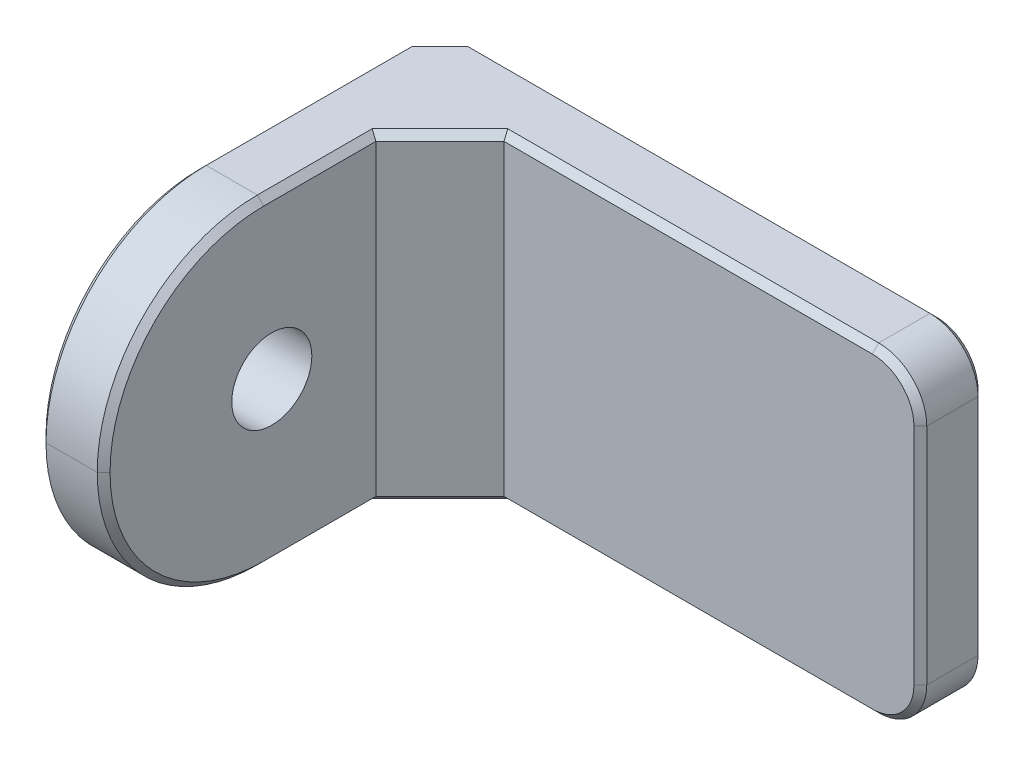
ISO-10303-21;
HEADER;
FILE_DESCRIPTION(('STEP AP214'),'2;1');
FILE_NAME('part.step','',(''),(''),'','','');
FILE_SCHEMA(('AUTOMOTIVE_DESIGN { 1 0 10303 214 1 1 1 1 }'));
ENDSEC;
DATA;
#1=APPLICATION_CONTEXT('core data for automotive mechanical design processes');
#2=APPLICATION_PROTOCOL_DEFINITION('international standard','automotive_design',2000,#1);
#3=PRODUCT_CONTEXT('',#1,'mechanical');
#4=PRODUCT('Part','Part','',(#3));
#5=PRODUCT_RELATED_PRODUCT_CATEGORY('part','',(#4));
#6=PRODUCT_DEFINITION_FORMATION('','',#4);
#7=PRODUCT_DEFINITION_CONTEXT('part definition',#1,'design');
#8=PRODUCT_DEFINITION('design','',#6,#7);
#9=PRODUCT_DEFINITION_SHAPE('','',#8);
#10=(LENGTH_UNIT() NAMED_UNIT(*) SI_UNIT(.MILLI.,.METRE.));
#11=(NAMED_UNIT(*) PLANE_ANGLE_UNIT() SI_UNIT($,.RADIAN.));
#12=(NAMED_UNIT(*) SI_UNIT($,.STERADIAN.) SOLID_ANGLE_UNIT());
#13=UNCERTAINTY_MEASURE_WITH_UNIT(LENGTH_MEASURE(1.E-05),#10,'distance_accuracy_value','');
#14=(GEOMETRIC_REPRESENTATION_CONTEXT(3) GLOBAL_UNCERTAINTY_ASSIGNED_CONTEXT((#13)) GLOBAL_UNIT_ASSIGNED_CONTEXT((#10,
#11,#12)) REPRESENTATION_CONTEXT('',''));
#15=CARTESIAN_POINT('',(0.,0.,0.));
#16=DIRECTION('',(0.,0.,1.));
#17=DIRECTION('',(1.,0.,0.));
#18=AXIS2_PLACEMENT_3D('',#15,#16,#17);
#19=CARTESIAN_POINT('',(0.,20.,0.));
#20=DIRECTION('',(1.,0.,0.));
#21=DIRECTION('',(0.,0.,-1.));
#22=AXIS2_PLACEMENT_3D('',#19,#20,#21);
#23=PLANE('',#22);
#24=DIRECTION('',(0.,-1.,0.));
#25=VECTOR('',#24,1.);
#26=CARTESIAN_POINT('',(0.,20.,-23.));
#27=LINE('',#26,#25);
#28=CARTESIAN_POINT('',(0.,19.6,-23.));
#29=VERTEX_POINT('',#28);
#30=CARTESIAN_POINT('',(0.,0.400000000000001,-23.));
#31=VERTEX_POINT('',#30);
#32=EDGE_CURVE('E377',#29,#31,#27,.T.);
#33=ORIENTED_EDGE('',*,*,#32,.T.);
#34=DIRECTION('',(0.,0.,1.));
#35=VECTOR('',#34,1.);
#36=CARTESIAN_POINT('',(0.,0.400000000000001,-10.));
#37=LINE('',#36,#35);
#38=CARTESIAN_POINT('',(0.,0.400000000000001,-10.));
#39=VERTEX_POINT('',#38);
#40=EDGE_CURVE('E317',#31,#39,#37,.T.);
#41=ORIENTED_EDGE('',*,*,#40,.T.);
#42=CARTESIAN_POINT('',(0.,10.,-10.));
#43=DIRECTION('',(1.,0.,0.));
#44=DIRECTION('',(0.,0.,-1.));
#45=AXIS2_PLACEMENT_3D('',#42,#43,#44);
#46=CIRCLE('',#45,9.6);
#47=CARTESIAN_POINT('',(0.,10.,-0.400000000000001));
#48=VERTEX_POINT('',#47);
#49=EDGE_CURVE('E319',#39,#48,#46,.F.);
#50=ORIENTED_EDGE('',*,*,#49,.T.);
#51=CARTESIAN_POINT('',(0.,10.,-10.));
#52=DIRECTION('',(1.,0.,0.));
#53=DIRECTION('',(0.,0.,-1.));
#54=AXIS2_PLACEMENT_3D('',#51,#52,#53);
#55=CIRCLE('',#54,9.6);
#56=CARTESIAN_POINT('',(0.,19.6,-10.));
#57=VERTEX_POINT('',#56);
#58=EDGE_CURVE('E323',#48,#57,#55,.F.);
#59=ORIENTED_EDGE('',*,*,#58,.T.);
#60=DIRECTION('',(0.,0.,-1.));
#61=VECTOR('',#60,1.);
#62=CARTESIAN_POINT('',(0.,19.6,0.));
#63=LINE('',#62,#61);
#64=EDGE_CURVE('E321',#57,#29,#63,.T.);
#65=ORIENTED_EDGE('',*,*,#64,.T.);
#66=EDGE_LOOP('',(#33,#41,#50,#59,#65));
#67=FACE_BOUND('',#66,.T.);
#68=CARTESIAN_POINT('',(0.,10.,-10.5));
#69=DIRECTION('',(1.,0.,0.));
#70=DIRECTION('',(0.,0.,-1.));
#71=AXIS2_PLACEMENT_3D('',#68,#69,#70);
#72=CIRCLE('',#71,2.5);
#73=CARTESIAN_POINT('',(0.,10.,-13.));
#74=VERTEX_POINT('',#73);
#75=EDGE_CURVE('E395',#74,#74,#72,.T.);
#76=ORIENTED_EDGE('',*,*,#75,.T.);
#77=EDGE_LOOP('',(#76));
#78=FACE_BOUND('',#77,.T.);
#79=ADVANCED_FACE('F37',(#67,#78),#23,.F.);
#80=CARTESIAN_POINT('',(4.,20.,0.));
#81=DIRECTION('',(-1.,0.,0.));
#82=DIRECTION('',(0.,0.,1.));
#83=AXIS2_PLACEMENT_3D('',#80,#81,#82);
#84=PLANE('',#83);
#85=CARTESIAN_POINT('',(4.,10.,-10.5));
#86=DIRECTION('',(1.,0.,0.));
#87=DIRECTION('',(0.,0.,-1.));
#88=AXIS2_PLACEMENT_3D('',#85,#86,#87);
#89=CIRCLE('',#88,2.5);
#90=CARTESIAN_POINT('',(4.,10.,-13.));
#91=VERTEX_POINT('',#90);
#92=EDGE_CURVE('E389',#91,#91,#89,.T.);
#93=ORIENTED_EDGE('',*,*,#92,.F.);
#94=EDGE_LOOP('',(#93));
#95=FACE_BOUND('',#94,.T.);
#96=CARTESIAN_POINT('',(4.,10.,-10.));
#97=DIRECTION('',(-1.,0.,0.));
#98=DIRECTION('',(0.,0.,1.));
#99=AXIS2_PLACEMENT_3D('',#96,#97,#98);
#100=CIRCLE('',#99,9.6);
#101=CARTESIAN_POINT('',(4.,10.,-0.399999999999998));
#102=VERTEX_POINT('',#101);
#103=CARTESIAN_POINT('',(4.,0.399999999999998,-10.));
#104=VERTEX_POINT('',#103);
#105=EDGE_CURVE('E47',#102,#104,#100,.F.);
#106=ORIENTED_EDGE('',*,*,#105,.T.);
#107=DIRECTION('',(0.,0.,-1.));
#108=VECTOR('',#107,1.);
#109=CARTESIAN_POINT('',(4.,0.399999999999998,-17.));
#110=LINE('',#109,#108);
#111=CARTESIAN_POINT('',(4.,0.399999999999998,-17.));
#112=VERTEX_POINT('',#111);
#113=EDGE_CURVE('E11',#104,#112,#110,.T.);
#114=ORIENTED_EDGE('',*,*,#113,.T.);
#115=DIRECTION('',(0.,1.,0.));
#116=VECTOR('',#115,1.);
#117=CARTESIAN_POINT('',(4.,20.,-17.));
#118=LINE('',#117,#116);
#119=CARTESIAN_POINT('',(4.,19.6,-17.));
#120=VERTEX_POINT('',#119);
#121=EDGE_CURVE('E380',#112,#120,#118,.T.);
#122=ORIENTED_EDGE('',*,*,#121,.T.);
#123=DIRECTION('',(0.,0.,1.));
#124=VECTOR('',#123,1.);
#125=CARTESIAN_POINT('',(4.,19.6,0.));
#126=LINE('',#125,#124);
#127=CARTESIAN_POINT('',(4.,19.6,-10.));
#128=VERTEX_POINT('',#127);
#129=EDGE_CURVE('E292',#120,#128,#126,.T.);
#130=ORIENTED_EDGE('',*,*,#129,.T.);
#131=CARTESIAN_POINT('',(4.,10.,-10.));
#132=DIRECTION('',(-1.,0.,0.));
#133=DIRECTION('',(0.,0.,1.));
#134=AXIS2_PLACEMENT_3D('',#131,#132,#133);
#135=CIRCLE('',#134,9.6);
#136=EDGE_CURVE('E58',#128,#102,#135,.F.);
#137=ORIENTED_EDGE('',*,*,#136,.T.);
#138=EDGE_LOOP('',(#106,#114,#122,#130,#137));
#139=FACE_BOUND('',#138,.T.);
#140=ADVANCED_FACE('F404',(#95,#139),#84,.F.);
#141=CARTESIAN_POINT('',(4.,20.,-21.));
#142=DIRECTION('',(0.,0.,-1.));
#143=DIRECTION('',(-1.,0.,0.));
#144=AXIS2_PLACEMENT_3D('',#141,#142,#143);
#145=PLANE('',#144);
#146=DIRECTION('',(0.,-1.,0.));
#147=VECTOR('',#146,1.);
#148=CARTESIAN_POINT('',(8.00000000000002,0.,-21.));
#149=LINE('',#148,#147);
#150=CARTESIAN_POINT('',(8.00000000000002,19.6,-21.));
#151=VERTEX_POINT('',#150);
#152=CARTESIAN_POINT('',(8.00000000000002,0.399999999999998,-21.));
#153=VERTEX_POINT('',#152);
#154=EDGE_CURVE('E383',#151,#153,#149,.T.);
#155=ORIENTED_EDGE('',*,*,#154,.T.);
#156=DIRECTION('',(1.,0.,0.));
#157=VECTOR('',#156,1.);
#158=CARTESIAN_POINT('',(31.,0.399999999999998,-21.));
#159=LINE('',#158,#157);
#160=CARTESIAN_POINT('',(31.,0.399999999999998,-21.));
#161=VERTEX_POINT('',#160);
#162=EDGE_CURVE('E294',#153,#161,#159,.T.);
#163=ORIENTED_EDGE('',*,*,#162,.T.);
#164=CARTESIAN_POINT('',(31.,3.,-21.));
#165=DIRECTION('',(0.,0.,-1.));
#166=DIRECTION('',(-1.,0.,0.));
#167=AXIS2_PLACEMENT_3D('',#164,#165,#166);
#168=CIRCLE('',#167,2.6);
#169=CARTESIAN_POINT('',(33.6,3.,-21.));
#170=VERTEX_POINT('',#169);
#171=EDGE_CURVE('E296',#161,#170,#168,.F.);
#172=ORIENTED_EDGE('',*,*,#171,.T.);
#173=DIRECTION('',(0.,1.,0.));
#174=VECTOR('',#173,1.);
#175=CARTESIAN_POINT('',(33.6,20.,-21.));
#176=LINE('',#175,#174);
#177=CARTESIAN_POINT('',(33.6,17.,-21.));
#178=VERTEX_POINT('',#177);
#179=EDGE_CURVE('E298',#170,#178,#176,.T.);
#180=ORIENTED_EDGE('',*,*,#179,.T.);
#181=CARTESIAN_POINT('',(31.,17.,-21.));
#182=DIRECTION('',(0.,0.,-1.));
#183=DIRECTION('',(-1.,0.,0.));
#184=AXIS2_PLACEMENT_3D('',#181,#182,#183);
#185=CIRCLE('',#184,2.6);
#186=CARTESIAN_POINT('',(31.,19.6,-21.));
#187=VERTEX_POINT('',#186);
#188=EDGE_CURVE('E300',#178,#187,#185,.F.);
#189=ORIENTED_EDGE('',*,*,#188,.T.);
#190=DIRECTION('',(-1.,0.,0.));
#191=VECTOR('',#190,1.);
#192=CARTESIAN_POINT('',(4.,19.6,-21.));
#193=LINE('',#192,#191);
#194=EDGE_CURVE('E302',#187,#151,#193,.T.);
#195=ORIENTED_EDGE('',*,*,#194,.T.);
#196=EDGE_LOOP('',(#155,#163,#172,#180,#189,#195));
#197=FACE_BOUND('',#196,.T.);
#198=ADVANCED_FACE('F406',(#197),#145,.F.);
#199=CARTESIAN_POINT('',(34.,20.,-25.));
#200=DIRECTION('',(-1.,0.,0.));
#201=DIRECTION('',(0.,0.,1.));
#202=AXIS2_PLACEMENT_3D('',#199,#200,#201);
#203=PLANE('',#202);
#204=DIRECTION('',(0.,0.,-1.));
#205=VECTOR('',#204,1.);
#206=CARTESIAN_POINT('',(34.,3.,-25.));
#207=LINE('',#206,#205);
#208=CARTESIAN_POINT('',(34.,3.,-21.4));
#209=VERTEX_POINT('',#208);
#210=CARTESIAN_POINT('',(34.,3.,-24.6));
#211=VERTEX_POINT('',#210);
#212=EDGE_CURVE('E208',#209,#211,#207,.T.);
#213=ORIENTED_EDGE('',*,*,#212,.T.);
#214=DIRECTION('',(0.,1.,0.));
#215=VECTOR('',#214,1.);
#216=CARTESIAN_POINT('',(34.,20.,-24.6));
#217=LINE('',#216,#215);
#218=CARTESIAN_POINT('',(34.,17.,-24.6));
#219=VERTEX_POINT('',#218);
#220=EDGE_CURVE('E341',#211,#219,#217,.T.);
#221=ORIENTED_EDGE('',*,*,#220,.T.);
#222=DIRECTION('',(0.,0.,-1.));
#223=VECTOR('',#222,1.);
#224=CARTESIAN_POINT('',(34.,17.,-25.));
#225=LINE('',#224,#223);
#226=CARTESIAN_POINT('',(34.,17.,-21.4));
#227=VERTEX_POINT('',#226);
#228=EDGE_CURVE('E371',#219,#227,#225,.F.);
#229=ORIENTED_EDGE('',*,*,#228,.T.);
#230=DIRECTION('',(0.,-1.,0.));
#231=VECTOR('',#230,1.);
#232=CARTESIAN_POINT('',(34.,20.,-21.4));
#233=LINE('',#232,#231);
#234=EDGE_CURVE('E219',#227,#209,#233,.T.);
#235=ORIENTED_EDGE('',*,*,#234,.T.);
#236=EDGE_LOOP('',(#213,#221,#229,#235));
#237=FACE_BOUND('',#236,.T.);
#238=ADVANCED_FACE('F412',(#237),#203,.F.);
#239=CARTESIAN_POINT('',(0.,20.,-25.));
#240=DIRECTION('',(0.,0.,1.));
#241=DIRECTION('',(1.,0.,0.));
#242=AXIS2_PLACEMENT_3D('',#239,#240,#241);
#243=PLANE('',#242);
#244=CARTESIAN_POINT('',(31.,3.,-25.));
#245=DIRECTION('',(0.,0.,1.));
#246=DIRECTION('',(1.,0.,0.));
#247=AXIS2_PLACEMENT_3D('',#244,#245,#246);
#248=CIRCLE('',#247,2.6);
#249=CARTESIAN_POINT('',(33.6,3.,-25.));
#250=VERTEX_POINT('',#249);
#251=CARTESIAN_POINT('',(31.,0.399999999999997,-25.));
#252=VERTEX_POINT('',#251);
#253=EDGE_CURVE('E346',#250,#252,#248,.F.);
#254=ORIENTED_EDGE('',*,*,#253,.T.);
#255=DIRECTION('',(-1.,0.,0.));
#256=VECTOR('',#255,1.);
#257=CARTESIAN_POINT('',(2.,0.399999999999998,-25.));
#258=LINE('',#257,#256);
#259=CARTESIAN_POINT('',(2.,0.399999999999998,-25.));
#260=VERTEX_POINT('',#259);
#261=EDGE_CURVE('E222',#252,#260,#258,.T.);
#262=ORIENTED_EDGE('',*,*,#261,.T.);
#263=DIRECTION('',(0.,1.,0.));
#264=VECTOR('',#263,1.);
#265=CARTESIAN_POINT('',(2.,20.,-25.));
#266=LINE('',#265,#264);
#267=CARTESIAN_POINT('',(2.,19.6,-25.));
#268=VERTEX_POINT('',#267);
#269=EDGE_CURVE('E374',#260,#268,#266,.T.);
#270=ORIENTED_EDGE('',*,*,#269,.T.);
#271=DIRECTION('',(1.,0.,0.));
#272=VECTOR('',#271,1.);
#273=CARTESIAN_POINT('',(0.,19.6,-25.));
#274=LINE('',#273,#272);
#275=CARTESIAN_POINT('',(31.,19.6,-25.));
#276=VERTEX_POINT('',#275);
#277=EDGE_CURVE('E352',#268,#276,#274,.T.);
#278=ORIENTED_EDGE('',*,*,#277,.T.);
#279=CARTESIAN_POINT('',(31.,17.,-25.));
#280=DIRECTION('',(0.,0.,1.));
#281=DIRECTION('',(1.,0.,0.));
#282=AXIS2_PLACEMENT_3D('',#279,#280,#281);
#283=CIRCLE('',#282,2.6);
#284=CARTESIAN_POINT('',(33.6,17.,-25.));
#285=VERTEX_POINT('',#284);
#286=EDGE_CURVE('E350',#276,#285,#283,.F.);
#287=ORIENTED_EDGE('',*,*,#286,.T.);
#288=DIRECTION('',(0.,-1.,0.));
#289=VECTOR('',#288,1.);
#290=CARTESIAN_POINT('',(33.6,20.,-25.));
#291=LINE('',#290,#289);
#292=EDGE_CURVE('E348',#285,#250,#291,.T.);
#293=ORIENTED_EDGE('',*,*,#292,.T.);
#294=EDGE_LOOP('',(#254,#262,#270,#278,#287,#293));
#295=FACE_BOUND('',#294,.T.);
#296=ADVANCED_FACE('F660',(#295),#243,.F.);
#297=CARTESIAN_POINT('',(0.,20.,0.));
#298=DIRECTION('',(0.,-1.,0.));
#299=DIRECTION('',(0.,0.,-1.));
#300=AXIS2_PLACEMENT_3D('',#297,#298,#299);
#301=PLANE('',#300);
#302=DIRECTION('',(0.,0.,-1.));
#303=VECTOR('',#302,1.);
#304=CARTESIAN_POINT('',(31.,20.,0.));
#305=LINE('',#304,#303);
#306=CARTESIAN_POINT('',(31.,20.,-21.4));
#307=VERTEX_POINT('',#306);
#308=CARTESIAN_POINT('',(31.,20.,-24.6));
#309=VERTEX_POINT('',#308);
#310=EDGE_CURVE('E207',#307,#309,#305,.T.);
#311=ORIENTED_EDGE('',*,*,#310,.T.);
#312=DIRECTION('',(-1.,0.,0.));
#313=VECTOR('',#312,1.);
#314=CARTESIAN_POINT('',(0.,20.,-24.6));
#315=LINE('',#314,#313);
#316=CARTESIAN_POINT('',(2.16568542494924,20.,-24.6));
#317=VERTEX_POINT('',#316);
#318=EDGE_CURVE('E325',#309,#317,#315,.T.);
#319=ORIENTED_EDGE('',*,*,#318,.T.);
#320=DIRECTION('',(-0.707106781186548,0.,0.707106781186548));
#321=VECTOR('',#320,1.);
#322=CARTESIAN_POINT('',(0.282842712474617,20.,-22.7171572875254));
#323=LINE('',#322,#321);
#324=CARTESIAN_POINT('',(0.399999999999999,20.,-22.8343145750508));
#325=VERTEX_POINT('',#324);
#326=EDGE_CURVE('E327',#317,#325,#323,.T.);
#327=ORIENTED_EDGE('',*,*,#326,.T.);
#328=DIRECTION('',(0.,0.,1.));
#329=VECTOR('',#328,1.);
#330=CARTESIAN_POINT('',(0.399999999999999,20.,0.));
#331=LINE('',#330,#329);
#332=CARTESIAN_POINT('',(0.399999999999999,20.,-10.));
#333=VERTEX_POINT('',#332);
#334=EDGE_CURVE('E329',#325,#333,#331,.T.);
#335=ORIENTED_EDGE('',*,*,#334,.T.);
#336=DIRECTION('',(1.,0.,0.));
#337=VECTOR('',#336,1.);
#338=CARTESIAN_POINT('',(0.,20.,-10.));
#339=LINE('',#338,#337);
#340=CARTESIAN_POINT('',(3.6,20.,-10.));
#341=VERTEX_POINT('',#340);
#342=EDGE_CURVE('E386',#333,#341,#339,.T.);
#343=ORIENTED_EDGE('',*,*,#342,.T.);
#344=DIRECTION('',(0.,0.,-1.));
#345=VECTOR('',#344,1.);
#346=CARTESIAN_POINT('',(3.6,20.,0.));
#347=LINE('',#346,#345);
#348=CARTESIAN_POINT('',(3.6,20.,-17.1656854249492));
#349=VERTEX_POINT('',#348);
#350=EDGE_CURVE('E335',#341,#349,#347,.T.);
#351=ORIENTED_EDGE('',*,*,#350,.T.);
#352=DIRECTION('',(0.707106781186551,0.,-0.707106781186544));
#353=VECTOR('',#352,1.);
#354=CARTESIAN_POINT('',(-6.78284271247464,20.,-6.7828427124747));
#355=LINE('',#354,#353);
#356=CARTESIAN_POINT('',(7.83431457505078,20.,-21.4));
#357=VERTEX_POINT('',#356);
#358=EDGE_CURVE('E333',#349,#357,#355,.T.);
#359=ORIENTED_EDGE('',*,*,#358,.T.);
#360=DIRECTION('',(1.,0.,0.));
#361=VECTOR('',#360,1.);
#362=CARTESIAN_POINT('',(0.,20.,-21.4));
#363=LINE('',#362,#361);
#364=EDGE_CURVE('E331',#357,#307,#363,.T.);
#365=ORIENTED_EDGE('',*,*,#364,.T.);
#366=EDGE_LOOP('',(#311,#319,#327,#335,#343,#351,#359,#365));
#367=FACE_BOUND('',#366,.T.);
#368=ADVANCED_FACE('F606',(#367),#301,.F.);
#369=CARTESIAN_POINT('',(0.,0.,0.));
#370=DIRECTION('',(0.,-1.,0.));
#371=DIRECTION('',(0.,0.,-1.));
#372=AXIS2_PLACEMENT_3D('',#369,#370,#371);
#373=PLANE('',#372);
#374=DIRECTION('',(0.707106781186548,0.,-0.707106781186548));
#375=VECTOR('',#374,1.);
#376=CARTESIAN_POINT('',(-11.2171572875254,0.,-11.2171572875254));
#377=LINE('',#376,#375);
#378=CARTESIAN_POINT('',(0.399999999999999,0.,-22.8343145750508));
#379=VERTEX_POINT('',#378);
#380=CARTESIAN_POINT('',(2.16568542494925,0.,-24.6));
#381=VERTEX_POINT('',#380);
#382=EDGE_CURVE('E193',#379,#381,#377,.T.);
#383=ORIENTED_EDGE('',*,*,#382,.T.);
#384=DIRECTION('',(1.,0.,0.));
#385=VECTOR('',#384,1.);
#386=CARTESIAN_POINT('',(31.,0.,-24.6));
#387=LINE('',#386,#385);
#388=CARTESIAN_POINT('',(31.,0.,-24.6));
#389=VERTEX_POINT('',#388);
#390=EDGE_CURVE('E187',#381,#389,#387,.T.);
#391=ORIENTED_EDGE('',*,*,#390,.T.);
#392=DIRECTION('',(0.,0.,-1.));
#393=VECTOR('',#392,1.);
#394=CARTESIAN_POINT('',(31.,0.,-21.));
#395=LINE('',#394,#393);
#396=CARTESIAN_POINT('',(31.,0.,-21.4));
#397=VERTEX_POINT('',#396);
#398=EDGE_CURVE('E190',#389,#397,#395,.F.);
#399=ORIENTED_EDGE('',*,*,#398,.T.);
#400=DIRECTION('',(-1.,0.,0.));
#401=VECTOR('',#400,1.);
#402=CARTESIAN_POINT('',(8.00000000000002,0.,-21.4));
#403=LINE('',#402,#401);
#404=CARTESIAN_POINT('',(7.83431457505081,0.,-21.4));
#405=VERTEX_POINT('',#404);
#406=EDGE_CURVE('E361',#397,#405,#403,.T.);
#407=ORIENTED_EDGE('',*,*,#406,.T.);
#408=DIRECTION('',(-0.707106781186551,0.,0.707106781186544));
#409=VECTOR('',#408,1.);
#410=CARTESIAN_POINT('',(3.71715728752539,0.,-17.2828427124746));
#411=LINE('',#410,#409);
#412=CARTESIAN_POINT('',(3.6,0.,-17.1656854249492));
#413=VERTEX_POINT('',#412);
#414=EDGE_CURVE('E363',#405,#413,#411,.T.);
#415=ORIENTED_EDGE('',*,*,#414,.T.);
#416=DIRECTION('',(0.,0.,1.));
#417=VECTOR('',#416,1.);
#418=CARTESIAN_POINT('',(3.6,0.,-10.));
#419=LINE('',#418,#417);
#420=CARTESIAN_POINT('',(3.6,0.,-10.));
#421=VERTEX_POINT('',#420);
#422=EDGE_CURVE('E366',#413,#421,#419,.T.);
#423=ORIENTED_EDGE('',*,*,#422,.T.);
#424=DIRECTION('',(1.,0.,0.));
#425=VECTOR('',#424,1.);
#426=CARTESIAN_POINT('',(0.,0.,-10.));
#427=LINE('',#426,#425);
#428=CARTESIAN_POINT('',(0.399999999999999,0.,-10.));
#429=VERTEX_POINT('',#428);
#430=EDGE_CURVE('E392',#421,#429,#427,.F.);
#431=ORIENTED_EDGE('',*,*,#430,.T.);
#432=DIRECTION('',(0.,0.,-1.));
#433=VECTOR('',#432,1.);
#434=CARTESIAN_POINT('',(0.399999999999999,0.,-23.));
#435=LINE('',#434,#433);
#436=EDGE_CURVE('E359',#429,#379,#435,.T.);
#437=ORIENTED_EDGE('',*,*,#436,.T.);
#438=EDGE_LOOP('',(#383,#391,#399,#407,#415,#423,#431,#437));
#439=FACE_BOUND('',#438,.T.);
#440=ADVANCED_FACE('F189',(#439),#373,.T.);
#441=CARTESIAN_POINT('',(-16.,10.,-10.5));
#442=DIRECTION('',(1.,0.,0.));
#443=DIRECTION('',(0.,0.,-1.));
#444=AXIS2_PLACEMENT_3D('',#441,#442,#443);
#445=CYLINDRICAL_SURFACE('',#444,2.5);
#446=ORIENTED_EDGE('',*,*,#92,.T.);
#447=EDGE_LOOP('',(#446));
#448=FACE_BOUND('',#447,.T.);
#449=ORIENTED_EDGE('',*,*,#75,.F.);
#450=EDGE_LOOP('',(#449));
#451=FACE_BOUND('',#450,.T.);
#452=ADVANCED_FACE('F401',(#448,#451),#445,.F.);
#453=CARTESIAN_POINT('',(0.,10.,-10.));
#454=DIRECTION('',(1.,0.,0.));
#455=DIRECTION('',(0.,0.,-1.));
#456=AXIS2_PLACEMENT_3D('',#453,#454,#455);
#457=CYLINDRICAL_SURFACE('',#456,10.);
#458=ORIENTED_EDGE('',*,*,#342,.F.);
#459=CARTESIAN_POINT('',(0.399999999999999,10.,-10.));
#460=DIRECTION('',(1.,0.,0.));
#461=DIRECTION('',(0.,0.,-1.));
#462=AXIS2_PLACEMENT_3D('',#459,#460,#461);
#463=CIRCLE('',#462,10.);
#464=CARTESIAN_POINT('',(0.399999999999999,10.,0.));
#465=VERTEX_POINT('',#464);
#466=EDGE_CURVE('E309',#333,#465,#463,.T.);
#467=ORIENTED_EDGE('',*,*,#466,.T.);
#468=DIRECTION('',(1.,0.,0.));
#469=VECTOR('',#468,1.);
#470=CARTESIAN_POINT('',(0.,10.,0.));
#471=LINE('',#470,#469);
#472=CARTESIAN_POINT('',(3.6,10.,0.));
#473=VERTEX_POINT('',#472);
#474=EDGE_CURVE('E251',#473,#465,#471,.F.);
#475=ORIENTED_EDGE('',*,*,#474,.F.);
#476=CARTESIAN_POINT('',(3.6,10.,-10.));
#477=DIRECTION('',(-1.,0.,0.));
#478=DIRECTION('',(0.,0.,1.));
#479=AXIS2_PLACEMENT_3D('',#476,#477,#478);
#480=CIRCLE('',#479,10.);
#481=EDGE_CURVE('E311',#473,#341,#480,.T.);
#482=ORIENTED_EDGE('',*,*,#481,.T.);
#483=EDGE_LOOP('',(#458,#467,#475,#482));
#484=FACE_BOUND('',#483,.T.);
#485=ADVANCED_FACE('F423',(#484),#457,.T.);
#486=CARTESIAN_POINT('',(0.,10.,-10.));
#487=DIRECTION('',(-1.,0.,0.));
#488=DIRECTION('',(0.,0.,1.));
#489=AXIS2_PLACEMENT_3D('',#486,#487,#488);
#490=CYLINDRICAL_SURFACE('',#489,10.);
#491=ORIENTED_EDGE('',*,*,#474,.T.);
#492=CARTESIAN_POINT('',(0.399999999999999,10.,-10.));
#493=DIRECTION('',(1.,0.,0.));
#494=DIRECTION('',(0.,0.,-1.));
#495=AXIS2_PLACEMENT_3D('',#492,#493,#494);
#496=CIRCLE('',#495,10.);
#497=EDGE_CURVE('E313',#465,#429,#496,.T.);
#498=ORIENTED_EDGE('',*,*,#497,.T.);
#499=ORIENTED_EDGE('',*,*,#430,.F.);
#500=CARTESIAN_POINT('',(3.6,10.,-10.));
#501=DIRECTION('',(-1.,0.,0.));
#502=DIRECTION('',(0.,0.,1.));
#503=AXIS2_PLACEMENT_3D('',#500,#501,#502);
#504=CIRCLE('',#503,10.);
#505=EDGE_CURVE('E315',#421,#473,#504,.T.);
#506=ORIENTED_EDGE('',*,*,#505,.T.);
#507=EDGE_LOOP('',(#491,#498,#499,#506));
#508=FACE_BOUND('',#507,.T.);
#509=ADVANCED_FACE('F419',(#508),#490,.T.);
#510=CARTESIAN_POINT('',(8.00000000000002,20.,-21.));
#511=DIRECTION('',(0.707106781186544,0.,0.70710678118655));
#512=DIRECTION('',(0.,1.,0.));
#513=AXIS2_PLACEMENT_3D('',#510,#511,#512);
#514=PLANE('',#513);
#515=ORIENTED_EDGE('',*,*,#121,.F.);
#516=DIRECTION('',(-0.707106781186551,0.,0.707106781186544));
#517=VECTOR('',#516,1.);
#518=CARTESIAN_POINT('',(8.00000000000002,0.399999999999991,-21.));
#519=LINE('',#518,#517);
#520=EDGE_CURVE('E304',#112,#153,#519,.F.);
#521=ORIENTED_EDGE('',*,*,#520,.T.);
#522=ORIENTED_EDGE('',*,*,#154,.F.);
#523=DIRECTION('',(0.707106781186551,0.,-0.707106781186544));
#524=VECTOR('',#523,1.);
#525=CARTESIAN_POINT('',(8.00000000000002,19.6,-21.));
#526=LINE('',#525,#524);
#527=EDGE_CURVE('E307',#151,#120,#526,.F.);
#528=ORIENTED_EDGE('',*,*,#527,.T.);
#529=EDGE_LOOP('',(#515,#521,#522,#528));
#530=FACE_BOUND('',#529,.T.);
#531=ADVANCED_FACE('F422',(#530),#514,.T.);
#532=CARTESIAN_POINT('',(0.,20.,-23.));
#533=DIRECTION('',(0.707106781186547,0.,0.707106781186547));
#534=DIRECTION('',(0.,-1.,0.));
#535=AXIS2_PLACEMENT_3D('',#532,#533,#534);
#536=PLANE('',#535);
#537=ORIENTED_EDGE('',*,*,#269,.F.);
#538=DIRECTION('',(0.707106781186548,0.,-0.707106781186548));
#539=VECTOR('',#538,1.);
#540=CARTESIAN_POINT('',(0.,0.400000000000011,-23.));
#541=LINE('',#540,#539);
#542=EDGE_CURVE('E354',#260,#31,#541,.F.);
#543=ORIENTED_EDGE('',*,*,#542,.T.);
#544=ORIENTED_EDGE('',*,*,#32,.F.);
#545=DIRECTION('',(-0.707106781186548,0.,0.707106781186548));
#546=VECTOR('',#545,1.);
#547=CARTESIAN_POINT('',(2.,19.6,-25.));
#548=LINE('',#547,#546);
#549=EDGE_CURVE('E197',#29,#268,#548,.F.);
#550=ORIENTED_EDGE('',*,*,#549,.T.);
#551=EDGE_LOOP('',(#537,#543,#544,#550));
#552=FACE_BOUND('',#551,.T.);
#553=ADVANCED_FACE('F434',(#552),#536,.F.);
#554=CARTESIAN_POINT('',(31.,3.,-25.));
#555=DIRECTION('',(0.,0.,1.));
#556=DIRECTION('',(1.,0.,0.));
#557=AXIS2_PLACEMENT_3D('',#554,#555,#556);
#558=CYLINDRICAL_SURFACE('',#557,3.);
#559=ORIENTED_EDGE('',*,*,#398,.F.);
#560=CARTESIAN_POINT('',(31.,3.,-24.6));
#561=DIRECTION('',(0.,0.,1.));
#562=DIRECTION('',(1.,0.,0.));
#563=AXIS2_PLACEMENT_3D('',#560,#561,#562);
#564=CIRCLE('',#563,3.);
#565=EDGE_CURVE('E203',#389,#211,#564,.T.);
#566=ORIENTED_EDGE('',*,*,#565,.T.);
#567=ORIENTED_EDGE('',*,*,#212,.F.);
#568=CARTESIAN_POINT('',(31.,3.,-21.4));
#569=DIRECTION('',(0.,0.,-1.));
#570=DIRECTION('',(-1.,0.,0.));
#571=AXIS2_PLACEMENT_3D('',#568,#569,#570);
#572=CIRCLE('',#571,3.);
#573=EDGE_CURVE('E206',#209,#397,#572,.T.);
#574=ORIENTED_EDGE('',*,*,#573,.T.);
#575=EDGE_LOOP('',(#559,#566,#567,#574));
#576=FACE_BOUND('',#575,.T.);
#577=ADVANCED_FACE('F201',(#576),#558,.T.);
#578=CARTESIAN_POINT('',(31.,17.,0.));
#579=DIRECTION('',(0.,0.,-1.));
#580=DIRECTION('',(-1.,0.,0.));
#581=AXIS2_PLACEMENT_3D('',#578,#579,#580);
#582=CYLINDRICAL_SURFACE('',#581,3.);
#583=ORIENTED_EDGE('',*,*,#228,.F.);
#584=CARTESIAN_POINT('',(31.,17.,-24.6));
#585=DIRECTION('',(0.,0.,1.));
#586=DIRECTION('',(1.,0.,0.));
#587=AXIS2_PLACEMENT_3D('',#584,#585,#586);
#588=CIRCLE('',#587,3.);
#589=EDGE_CURVE('E337',#219,#309,#588,.T.);
#590=ORIENTED_EDGE('',*,*,#589,.T.);
#591=ORIENTED_EDGE('',*,*,#310,.F.);
#592=CARTESIAN_POINT('',(31.,17.,-21.4));
#593=DIRECTION('',(0.,0.,-1.));
#594=DIRECTION('',(-1.,0.,0.));
#595=AXIS2_PLACEMENT_3D('',#592,#593,#594);
#596=CIRCLE('',#595,3.);
#597=EDGE_CURVE('E339',#307,#227,#596,.T.);
#598=ORIENTED_EDGE('',*,*,#597,.T.);
#599=EDGE_LOOP('',(#583,#590,#591,#598));
#600=FACE_BOUND('',#599,.T.);
#601=ADVANCED_FACE('F444',(#600),#582,.T.);
#602=CARTESIAN_POINT('',(-11.2171572875254,20.,-11.2171572875254));
#603=DIRECTION('',(0.5,-0.707106781186547,0.5));
#604=DIRECTION('',(-0.707106781186548,0.,0.707106781186548));
#605=AXIS2_PLACEMENT_3D('',#602,#603,#604);
#606=PLANE('',#605);
#607=DIRECTION('',(-0.678598344545845,-0.678598344545848,-0.281084637714823));
#608=VECTOR('',#607,1.);
#609=CARTESIAN_POINT('',(4.75549867667889,24.3554986766789,-21.0302079522723));
#610=LINE('',#609,#608);
#611=EDGE_CURVE('E245',#325,#29,#610,.T.);
#612=ORIENTED_EDGE('',*,*,#611,.F.);
#613=ORIENTED_EDGE('',*,*,#326,.F.);
#614=DIRECTION('',(-0.28108463771482,-0.678598344545847,-0.678598344545847));
#615=VECTOR('',#614,1.);
#616=CARTESIAN_POINT('',(3.66101730552664,23.6100505063388,-20.9899494936612));
#617=LINE('',#616,#615);
#618=EDGE_CURVE('E248',#268,#317,#617,.F.);
#619=ORIENTED_EDGE('',*,*,#618,.F.);
#620=ORIENTED_EDGE('',*,*,#549,.F.);
#621=EDGE_LOOP('',(#612,#613,#619,#620));
#622=FACE_BOUND('',#621,.T.);
#623=ADVANCED_FACE('F447',(#622),#606,.F.);
#624=CARTESIAN_POINT('',(0.,20.,-24.6));
#625=DIRECTION('',(0.,-0.707106781186548,0.707106781186548));
#626=DIRECTION('',(-1.,0.,0.));
#627=AXIS2_PLACEMENT_3D('',#624,#625,#626);
#628=PLANE('',#627);
#629=ORIENTED_EDGE('',*,*,#618,.T.);
#630=ORIENTED_EDGE('',*,*,#318,.F.);
#631=DIRECTION('',(0.,0.707106781186548,0.707106781186548));
#632=VECTOR('',#631,1.);
#633=CARTESIAN_POINT('',(31.,19.6,-25.));
#634=LINE('',#633,#632);
#635=EDGE_CURVE('E242',#276,#309,#634,.T.);
#636=ORIENTED_EDGE('',*,*,#635,.F.);
#637=ORIENTED_EDGE('',*,*,#277,.F.);
#638=EDGE_LOOP('',(#629,#630,#636,#637));
#639=FACE_BOUND('',#638,.T.);
#640=ADVANCED_FACE('F507',(#639),#628,.F.);
#641=CARTESIAN_POINT('',(0.399999999999999,20.,0.));
#642=DIRECTION('',(0.707106781186549,-0.707106781186546,0.));
#643=DIRECTION('',(0.,0.,1.));
#644=AXIS2_PLACEMENT_3D('',#641,#642,#643);
#645=PLANE('',#644);
#646=ORIENTED_EDGE('',*,*,#611,.T.);
#647=ORIENTED_EDGE('',*,*,#64,.F.);
#648=DIRECTION('',(-0.707106781186546,-0.707106781186549,0.));
#649=VECTOR('',#648,1.);
#650=CARTESIAN_POINT('',(0.399999999999999,20.,-10.));
#651=LINE('',#650,#649);
#652=EDGE_CURVE('E239',#333,#57,#651,.T.);
#653=ORIENTED_EDGE('',*,*,#652,.F.);
#654=ORIENTED_EDGE('',*,*,#334,.F.);
#655=EDGE_LOOP('',(#646,#647,#653,#654));
#656=FACE_BOUND('',#655,.T.);
#657=ADVANCED_FACE('F500',(#656),#645,.F.);
#658=CARTESIAN_POINT('',(31.,17.,-25.));
#659=DIRECTION('',(0.,0.,1.));
#660=DIRECTION('',(1.,0.,0.));
#661=AXIS2_PLACEMENT_3D('',#658,#659,#660);
#662=CONICAL_SURFACE('',#661,2.6,0.785398163397449);
#663=ORIENTED_EDGE('',*,*,#635,.T.);
#664=ORIENTED_EDGE('',*,*,#589,.F.);
#665=DIRECTION('',(0.707106781186548,0.,0.707106781186548));
#666=VECTOR('',#665,1.);
#667=CARTESIAN_POINT('',(33.6,17.,-25.));
#668=LINE('',#667,#666);
#669=EDGE_CURVE('E236',#285,#219,#668,.T.);
#670=ORIENTED_EDGE('',*,*,#669,.F.);
#671=ORIENTED_EDGE('',*,*,#286,.F.);
#672=EDGE_LOOP('',(#663,#664,#670,#671));
#673=FACE_BOUND('',#672,.T.);
#674=ADVANCED_FACE('F493',(#673),#662,.T.);
#675=CARTESIAN_POINT('',(0.,10.,-10.));
#676=DIRECTION('',(1.,0.,0.));
#677=DIRECTION('',(0.,0.,-1.));
#678=AXIS2_PLACEMENT_3D('',#675,#676,#677);
#679=CONICAL_SURFACE('',#678,9.6,0.78539816339745);
#680=ORIENTED_EDGE('',*,*,#652,.T.);
#681=ORIENTED_EDGE('',*,*,#58,.F.);
#682=DIRECTION('',(-0.707106781186546,0.,-0.707106781186549));
#683=VECTOR('',#682,1.);
#684=CARTESIAN_POINT('',(0.399999999999999,10.,0.));
#685=LINE('',#684,#683);
#686=EDGE_CURVE('E233',#465,#48,#685,.T.);
#687=ORIENTED_EDGE('',*,*,#686,.F.);
#688=ORIENTED_EDGE('',*,*,#466,.F.);
#689=EDGE_LOOP('',(#680,#681,#687,#688));
#690=FACE_BOUND('',#689,.T.);
#691=ADVANCED_FACE('F486',(#690),#679,.T.);
#692=CARTESIAN_POINT('',(33.6,20.,-25.));
#693=DIRECTION('',(-0.707106781186548,0.,0.707106781186548));
#694=DIRECTION('',(0.,-1.,0.));
#695=AXIS2_PLACEMENT_3D('',#692,#693,#694);
#696=PLANE('',#695);
#697=ORIENTED_EDGE('',*,*,#669,.T.);
#698=ORIENTED_EDGE('',*,*,#220,.F.);
#699=DIRECTION('',(0.707106781186548,0.,0.707106781186548));
#700=VECTOR('',#699,1.);
#701=CARTESIAN_POINT('',(33.6,3.,-25.));
#702=LINE('',#701,#700);
#703=EDGE_CURVE('E218',#250,#211,#702,.T.);
#704=ORIENTED_EDGE('',*,*,#703,.F.);
#705=ORIENTED_EDGE('',*,*,#292,.F.);
#706=EDGE_LOOP('',(#697,#698,#704,#705));
#707=FACE_BOUND('',#706,.T.);
#708=ADVANCED_FACE('F479',(#707),#696,.F.);
#709=CARTESIAN_POINT('',(0.,10.,-10.));
#710=DIRECTION('',(1.,0.,0.));
#711=DIRECTION('',(0.,0.,-1.));
#712=AXIS2_PLACEMENT_3D('',#709,#710,#711);
#713=CONICAL_SURFACE('',#712,9.6,0.78539816339745);
#714=ORIENTED_EDGE('',*,*,#686,.T.);
#715=ORIENTED_EDGE('',*,*,#49,.F.);
#716=DIRECTION('',(-0.707106781186546,0.707106781186549,0.));
#717=VECTOR('',#716,1.);
#718=CARTESIAN_POINT('',(0.399999999999999,0.,-10.));
#719=LINE('',#718,#717);
#720=EDGE_CURVE('E223',#429,#39,#719,.T.);
#721=ORIENTED_EDGE('',*,*,#720,.F.);
#722=ORIENTED_EDGE('',*,*,#497,.F.);
#723=EDGE_LOOP('',(#714,#715,#721,#722));
#724=FACE_BOUND('',#723,.T.);
#725=ADVANCED_FACE('F473',(#724),#713,.T.);
#726=CARTESIAN_POINT('',(31.,3.,-25.));
#727=DIRECTION('',(0.,0.,1.));
#728=DIRECTION('',(1.,0.,0.));
#729=AXIS2_PLACEMENT_3D('',#726,#727,#728);
#730=CONICAL_SURFACE('',#729,2.6,0.785398163397448);
#731=ORIENTED_EDGE('',*,*,#703,.T.);
#732=ORIENTED_EDGE('',*,*,#565,.F.);
#733=DIRECTION('',(0.,-0.707106781186548,0.707106781186548));
#734=VECTOR('',#733,1.);
#735=CARTESIAN_POINT('',(31.,0.399999999999997,-25.));
#736=LINE('',#735,#734);
#737=EDGE_CURVE('E215',#252,#389,#736,.T.);
#738=ORIENTED_EDGE('',*,*,#737,.F.);
#739=ORIENTED_EDGE('',*,*,#253,.F.);
#740=EDGE_LOOP('',(#731,#732,#738,#739));
#741=FACE_BOUND('',#740,.T.);
#742=ADVANCED_FACE('F213',(#741),#730,.T.);
#743=CARTESIAN_POINT('',(0.,0.400000000000001,0.));
#744=DIRECTION('',(-0.707106781186549,-0.707106781186546,0.));
#745=DIRECTION('',(0.,0.,-1.));
#746=AXIS2_PLACEMENT_3D('',#743,#744,#745);
#747=PLANE('',#746);
#748=ORIENTED_EDGE('',*,*,#720,.T.);
#749=ORIENTED_EDGE('',*,*,#40,.F.);
#750=DIRECTION('',(0.678598344545848,-0.678598344545851,0.281084637714808));
#751=VECTOR('',#750,1.);
#752=CARTESIAN_POINT('',(4.38710210610237,-3.98710210610239,-21.1828028081369));
#753=LINE('',#752,#751);
#754=EDGE_CURVE('E224',#379,#31,#753,.F.);
#755=ORIENTED_EDGE('',*,*,#754,.F.);
#756=ORIENTED_EDGE('',*,*,#436,.F.);
#757=EDGE_LOOP('',(#748,#749,#755,#756));
#758=FACE_BOUND('',#757,.T.);
#759=ADVANCED_FACE('F461',(#758),#747,.T.);
#760=CARTESIAN_POINT('',(0.,0.399999999999998,-25.));
#761=DIRECTION('',(0.,-0.707106781186548,-0.707106781186548));
#762=DIRECTION('',(1.,0.,0.));
#763=AXIS2_PLACEMENT_3D('',#760,#761,#762);
#764=PLANE('',#763);
#765=ORIENTED_EDGE('',*,*,#737,.T.);
#766=ORIENTED_EDGE('',*,*,#390,.F.);
#767=DIRECTION('',(-0.281084637714805,0.67859834454585,-0.67859834454585));
#768=VECTOR('',#767,1.);
#769=CARTESIAN_POINT('',(1.8419828528815,0.781487139661075,-25.3814871396611));
#770=LINE('',#769,#768);
#771=EDGE_CURVE('E228',#260,#381,#770,.F.);
#772=ORIENTED_EDGE('',*,*,#771,.F.);
#773=ORIENTED_EDGE('',*,*,#261,.F.);
#774=EDGE_LOOP('',(#765,#766,#772,#773));
#775=FACE_BOUND('',#774,.T.);
#776=ADVANCED_FACE('F221',(#775),#764,.T.);
#777=CARTESIAN_POINT('',(-11.2171572875254,0.,-11.2171572875254));
#778=DIRECTION('',(-0.500000000000004,-0.707106781186541,-0.500000000000004));
#779=DIRECTION('',(-0.707106781186548,0.,0.707106781186548));
#780=AXIS2_PLACEMENT_3D('',#777,#778,#779);
#781=PLANE('',#780);
#782=ORIENTED_EDGE('',*,*,#754,.T.);
#783=ORIENTED_EDGE('',*,*,#542,.F.);
#784=ORIENTED_EDGE('',*,*,#771,.T.);
#785=ORIENTED_EDGE('',*,*,#382,.F.);
#786=EDGE_LOOP('',(#782,#783,#784,#785));
#787=FACE_BOUND('',#786,.T.);
#788=ADVANCED_FACE('F450',(#787),#781,.T.);
#789=CARTESIAN_POINT('',(0.,20.,-21.4));
#790=DIRECTION('',(0.,-0.707106781186554,-0.707106781186541));
#791=DIRECTION('',(1.,0.,0.));
#792=AXIS2_PLACEMENT_3D('',#789,#790,#791);
#793=PLANE('',#792);
#794=DIRECTION('',(0.,-0.707106781186541,0.707106781186554));
#795=VECTOR('',#794,1.);
#796=CARTESIAN_POINT('',(31.,20.,-21.4));
#797=LINE('',#796,#795);
#798=EDGE_CURVE('E276',#307,#187,#797,.T.);
#799=ORIENTED_EDGE('',*,*,#798,.F.);
#800=ORIENTED_EDGE('',*,*,#364,.F.);
#801=DIRECTION('',(0.281084637714821,-0.678598344545841,0.678598344545853));
#802=VECTOR('',#801,1.);
#803=CARTESIAN_POINT('',(7.2153365556614,21.4943451292207,-22.8943451292207));
#804=LINE('',#803,#802);
#805=EDGE_CURVE('E42',#151,#357,#804,.F.);
#806=ORIENTED_EDGE('',*,*,#805,.F.);
#807=ORIENTED_EDGE('',*,*,#194,.F.);
#808=EDGE_LOOP('',(#799,#800,#806,#807));
#809=FACE_BOUND('',#808,.T.);
#810=ADVANCED_FACE('F40',(#809),#793,.F.);
#811=CARTESIAN_POINT('',(-6.78284271247464,20.,-6.7828427124747));
#812=DIRECTION('',(0.499999999999994,0.707106781186554,0.499999999999998));
#813=DIRECTION('',(-0.707106781186551,0.,0.707106781186544));
#814=AXIS2_PLACEMENT_3D('',#811,#812,#813);
#815=PLANE('',#814);
#816=ORIENTED_EDGE('',*,*,#805,.T.);
#817=ORIENTED_EDGE('',*,*,#358,.F.);
#818=DIRECTION('',(0.678598344545852,-0.67859834454584,0.281084637714824));
#819=VECTOR('',#818,1.);
#820=CARTESIAN_POINT('',(0.799205923830565,22.8007940761694,-18.3258123167129));
#821=LINE('',#820,#819);
#822=EDGE_CURVE('E274',#120,#349,#821,.F.);
#823=ORIENTED_EDGE('',*,*,#822,.F.);
#824=ORIENTED_EDGE('',*,*,#527,.F.);
#825=EDGE_LOOP('',(#816,#817,#823,#824));
#826=FACE_BOUND('',#825,.T.);
#827=ADVANCED_FACE('F581',(#826),#815,.T.);
#828=CARTESIAN_POINT('',(31.,17.,-21.));
#829=DIRECTION('',(0.,0.,-1.));
#830=DIRECTION('',(-1.,0.,0.));
#831=AXIS2_PLACEMENT_3D('',#828,#829,#830);
#832=CONICAL_SURFACE('',#831,2.6,0.785398163397441);
#833=ORIENTED_EDGE('',*,*,#798,.T.);
#834=ORIENTED_EDGE('',*,*,#188,.F.);
#835=DIRECTION('',(-0.707106781186541,0.,0.707106781186554));
#836=VECTOR('',#835,1.);
#837=CARTESIAN_POINT('',(34.,17.,-21.4));
#838=LINE('',#837,#836);
#839=EDGE_CURVE('E271',#227,#178,#838,.T.);
#840=ORIENTED_EDGE('',*,*,#839,.F.);
#841=ORIENTED_EDGE('',*,*,#597,.F.);
#842=EDGE_LOOP('',(#833,#834,#840,#841));
#843=FACE_BOUND('',#842,.T.);
#844=ADVANCED_FACE('F575',(#843),#832,.T.);
#845=CARTESIAN_POINT('',(3.6,20.,0.));
#846=DIRECTION('',(-0.707106781186541,-0.707106781186554,0.));
#847=DIRECTION('',(0.,0.,-1.));
#848=AXIS2_PLACEMENT_3D('',#845,#846,#847);
#849=PLANE('',#848);
#850=ORIENTED_EDGE('',*,*,#822,.T.);
#851=ORIENTED_EDGE('',*,*,#350,.F.);
#852=DIRECTION('',(-0.707106781186554,0.707106781186541,0.));
#853=VECTOR('',#852,1.);
#854=CARTESIAN_POINT('',(4.,19.6,-10.));
#855=LINE('',#854,#853);
#856=EDGE_CURVE('E268',#128,#341,#855,.T.);
#857=ORIENTED_EDGE('',*,*,#856,.F.);
#858=ORIENTED_EDGE('',*,*,#129,.F.);
#859=EDGE_LOOP('',(#850,#851,#857,#858));
#860=FACE_BOUND('',#859,.T.);
#861=ADVANCED_FACE('F568',(#860),#849,.F.);
#862=CARTESIAN_POINT('',(34.,20.,-21.4));
#863=DIRECTION('',(-0.707106781186554,0.,-0.707106781186541));
#864=DIRECTION('',(0.,-1.,0.));
#865=AXIS2_PLACEMENT_3D('',#862,#863,#864);
#866=PLANE('',#865);
#867=ORIENTED_EDGE('',*,*,#839,.T.);
#868=ORIENTED_EDGE('',*,*,#179,.F.);
#869=DIRECTION('',(-0.707106781186541,0.,0.707106781186554));
#870=VECTOR('',#869,1.);
#871=CARTESIAN_POINT('',(34.,3.,-21.4));
#872=LINE('',#871,#870);
#873=EDGE_CURVE('E265',#209,#170,#872,.T.);
#874=ORIENTED_EDGE('',*,*,#873,.F.);
#875=ORIENTED_EDGE('',*,*,#234,.F.);
#876=EDGE_LOOP('',(#867,#868,#874,#875));
#877=FACE_BOUND('',#876,.T.);
#878=ADVANCED_FACE('F561',(#877),#866,.F.);
#879=CARTESIAN_POINT('',(4.,10.,-10.));
#880=DIRECTION('',(-1.,0.,0.));
#881=DIRECTION('',(0.,0.,1.));
#882=AXIS2_PLACEMENT_3D('',#879,#880,#881);
#883=CONICAL_SURFACE('',#882,9.6,0.78539816339744);
#884=ORIENTED_EDGE('',*,*,#856,.T.);
#885=ORIENTED_EDGE('',*,*,#481,.F.);
#886=DIRECTION('',(-0.707106781186554,0.,0.707106781186541));
#887=VECTOR('',#886,1.);
#888=CARTESIAN_POINT('',(4.,10.,-0.399999999999998));
#889=LINE('',#888,#887);
#890=EDGE_CURVE('E262',#102,#473,#889,.T.);
#891=ORIENTED_EDGE('',*,*,#890,.F.);
#892=ORIENTED_EDGE('',*,*,#136,.F.);
#893=EDGE_LOOP('',(#884,#885,#891,#892));
#894=FACE_BOUND('',#893,.T.);
#895=ADVANCED_FACE('F554',(#894),#883,.T.);
#896=CARTESIAN_POINT('',(31.,3.,-21.));
#897=DIRECTION('',(0.,0.,-1.));
#898=DIRECTION('',(-1.,0.,0.));
#899=AXIS2_PLACEMENT_3D('',#896,#897,#898);
#900=CONICAL_SURFACE('',#899,2.6,0.785398163397441);
#901=ORIENTED_EDGE('',*,*,#873,.T.);
#902=ORIENTED_EDGE('',*,*,#171,.F.);
#903=DIRECTION('',(0.,0.707106781186542,0.707106781186553));
#904=VECTOR('',#903,1.);
#905=CARTESIAN_POINT('',(31.,0.,-21.4));
#906=LINE('',#905,#904);
#907=EDGE_CURVE('E259',#397,#161,#906,.T.);
#908=ORIENTED_EDGE('',*,*,#907,.F.);
#909=ORIENTED_EDGE('',*,*,#573,.F.);
#910=EDGE_LOOP('',(#901,#902,#908,#909));
#911=FACE_BOUND('',#910,.T.);
#912=ADVANCED_FACE('F547',(#911),#900,.T.);
#913=CARTESIAN_POINT('',(4.,10.,-10.));
#914=DIRECTION('',(-1.,0.,0.));
#915=DIRECTION('',(0.,0.,1.));
#916=AXIS2_PLACEMENT_3D('',#913,#914,#915);
#917=CONICAL_SURFACE('',#916,9.6,0.78539816339744);
#918=ORIENTED_EDGE('',*,*,#890,.T.);
#919=ORIENTED_EDGE('',*,*,#505,.F.);
#920=DIRECTION('',(-0.707106781186554,-0.707106781186541,0.));
#921=VECTOR('',#920,1.);
#922=CARTESIAN_POINT('',(4.,0.399999999999998,-10.));
#923=LINE('',#922,#921);
#924=EDGE_CURVE('E256',#104,#421,#923,.T.);
#925=ORIENTED_EDGE('',*,*,#924,.F.);
#926=ORIENTED_EDGE('',*,*,#105,.F.);
#927=EDGE_LOOP('',(#918,#919,#925,#926));
#928=FACE_BOUND('',#927,.T.);
#929=ADVANCED_FACE('F540',(#928),#917,.T.);
#930=CARTESIAN_POINT('',(4.,0.399999999999998,-21.));
#931=DIRECTION('',(0.,-0.707106781186554,0.707106781186541));
#932=DIRECTION('',(-1.,0.,0.));
#933=AXIS2_PLACEMENT_3D('',#930,#931,#932);
#934=PLANE('',#933);
#935=ORIENTED_EDGE('',*,*,#907,.T.);
#936=ORIENTED_EDGE('',*,*,#162,.F.);
#937=DIRECTION('',(0.281084637714794,0.678598344545847,0.678598344545858));
#938=VECTOR('',#937,1.);
#939=CARTESIAN_POINT('',(9.46756259006908,3.94300950857639,-17.4569904914235));
#940=LINE('',#939,#938);
#941=EDGE_CURVE('E254',#405,#153,#940,.T.);
#942=ORIENTED_EDGE('',*,*,#941,.F.);
#943=ORIENTED_EDGE('',*,*,#406,.F.);
#944=EDGE_LOOP('',(#935,#936,#942,#943));
#945=FACE_BOUND('',#944,.T.);
#946=ADVANCED_FACE('F533',(#945),#934,.T.);
#947=CARTESIAN_POINT('',(4.,0.399999999999998,0.));
#948=DIRECTION('',(0.707106781186541,-0.707106781186554,0.));
#949=DIRECTION('',(0.,0.,1.));
#950=AXIS2_PLACEMENT_3D('',#947,#948,#949);
#951=PLANE('',#950);
#952=ORIENTED_EDGE('',*,*,#924,.T.);
#953=ORIENTED_EDGE('',*,*,#422,.F.);
#954=DIRECTION('',(-0.678598344545858,-0.678598344545846,-0.281084637714797));
#955=VECTOR('',#954,1.);
#956=CARTESIAN_POINT('',(0.799205923830318,-2.80079407616963,-18.3258123167128));
#957=LINE('',#956,#955);
#958=EDGE_CURVE('E252',#112,#413,#957,.T.);
#959=ORIENTED_EDGE('',*,*,#958,.F.);
#960=ORIENTED_EDGE('',*,*,#113,.F.);
#961=EDGE_LOOP('',(#952,#953,#959,#960));
#962=FACE_BOUND('',#961,.T.);
#963=ADVANCED_FACE('F526',(#962),#951,.T.);
#964=CARTESIAN_POINT('',(-6.78284271247463,0.,-6.78284271247469));
#965=DIRECTION('',(-0.500000000000001,0.707106781186543,-0.500000000000005));
#966=DIRECTION('',(-0.707106781186551,0.,0.707106781186544));
#967=AXIS2_PLACEMENT_3D('',#964,#965,#966);
#968=PLANE('',#967);
#969=ORIENTED_EDGE('',*,*,#941,.T.);
#970=ORIENTED_EDGE('',*,*,#520,.F.);
#971=ORIENTED_EDGE('',*,*,#958,.T.);
#972=ORIENTED_EDGE('',*,*,#414,.F.);
#973=EDGE_LOOP('',(#969,#970,#971,#972));
#974=FACE_BOUND('',#973,.T.);
#975=ADVANCED_FACE('F520',(#974),#968,.F.);
#976=CLOSED_SHELL('',(#79,#140,#198,#238,#296,#368,#440,#452,#485,#509,#531,#553,#577,#601,#623,
#640,#657,#674,#691,#708,#725,#742,#759,#776,#788,#810,#827,#844,#861,#878,#895,#912,#929,#946,
#963,#975));
#977=MANIFOLD_SOLID_BREP('B2',#976);
#978=ADVANCED_BREP_SHAPE_REPRESENTATION('',(#18,#977),#14);
#979=SHAPE_DEFINITION_REPRESENTATION(#9,#978);
ENDSEC;
END-ISO-10303-21;
